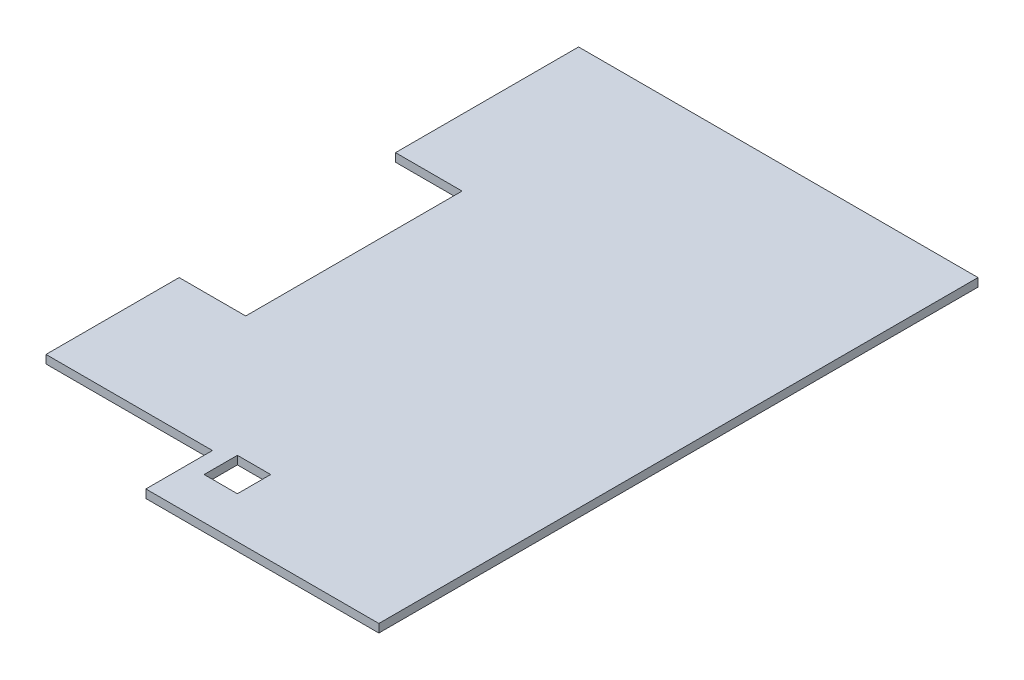
ISO-10303-21;
HEADER;
FILE_DESCRIPTION(('STEP AP214'),'2;1');
FILE_NAME('part.step','',(''),(''),'','','');
FILE_SCHEMA(('AUTOMOTIVE_DESIGN { 1 0 10303 214 1 1 1 1 }'));
ENDSEC;
DATA;
#1=APPLICATION_CONTEXT('core data for automotive mechanical design processes');
#2=APPLICATION_PROTOCOL_DEFINITION('international standard','automotive_design',2000,#1);
#3=PRODUCT_CONTEXT('',#1,'mechanical');
#4=PRODUCT('Part','Part','',(#3));
#5=PRODUCT_RELATED_PRODUCT_CATEGORY('part','',(#4));
#6=PRODUCT_DEFINITION_FORMATION('','',#4);
#7=PRODUCT_DEFINITION_CONTEXT('part definition',#1,'design');
#8=PRODUCT_DEFINITION('design','',#6,#7);
#9=PRODUCT_DEFINITION_SHAPE('','',#8);
#10=(LENGTH_UNIT() NAMED_UNIT(*) SI_UNIT(.MILLI.,.METRE.));
#11=(NAMED_UNIT(*) PLANE_ANGLE_UNIT() SI_UNIT($,.RADIAN.));
#12=(NAMED_UNIT(*) SI_UNIT($,.STERADIAN.) SOLID_ANGLE_UNIT());
#13=UNCERTAINTY_MEASURE_WITH_UNIT(LENGTH_MEASURE(1.E-05),#10,'distance_accuracy_value','');
#14=(GEOMETRIC_REPRESENTATION_CONTEXT(3) GLOBAL_UNCERTAINTY_ASSIGNED_CONTEXT((#13)) GLOBAL_UNIT_ASSIGNED_CONTEXT((#10,
#11,#12)) REPRESENTATION_CONTEXT('',''));
#15=CARTESIAN_POINT('',(0.,0.,0.));
#16=DIRECTION('',(0.,0.,1.));
#17=DIRECTION('',(1.,0.,0.));
#18=AXIS2_PLACEMENT_3D('',#15,#16,#17);
#19=CARTESIAN_POINT('',(0.,12.7,-203.2));
#20=DIRECTION('',(1.,0.,0.));
#21=DIRECTION('',(0.,0.,-1.));
#22=AXIS2_PLACEMENT_3D('',#19,#20,#21);
#23=PLANE('',#22);
#24=DIRECTION('',(0.,0.,1.));
#25=VECTOR('',#24,1.);
#26=CARTESIAN_POINT('',(0.,0.,-203.2));
#27=LINE('',#26,#25);
#28=CARTESIAN_POINT('',(0.,0.,-203.2));
#29=VERTEX_POINT('',#28);
#30=CARTESIAN_POINT('',(0.,0.,0.));
#31=VERTEX_POINT('',#30);
#32=EDGE_CURVE('E166',#29,#31,#27,.T.);
#33=ORIENTED_EDGE('',*,*,#32,.T.);
#34=DIRECTION('',(0.,-1.,0.));
#35=VECTOR('',#34,1.);
#36=CARTESIAN_POINT('',(0.,12.7,0.));
#37=LINE('',#36,#35);
#38=CARTESIAN_POINT('',(0.,12.7,0.));
#39=VERTEX_POINT('',#38);
#40=EDGE_CURVE('E11',#39,#31,#37,.T.);
#41=ORIENTED_EDGE('',*,*,#40,.F.);
#42=DIRECTION('',(0.,0.,1.));
#43=VECTOR('',#42,1.);
#44=CARTESIAN_POINT('',(0.,12.7,-203.2));
#45=LINE('',#44,#43);
#46=CARTESIAN_POINT('',(0.,12.7,-203.2));
#47=VERTEX_POINT('',#46);
#48=EDGE_CURVE('E170',#47,#39,#45,.T.);
#49=ORIENTED_EDGE('',*,*,#48,.F.);
#50=DIRECTION('',(0.,-1.,0.));
#51=VECTOR('',#50,1.);
#52=CARTESIAN_POINT('',(0.,12.7,-203.2));
#53=LINE('',#52,#51);
#54=EDGE_CURVE('E192',#47,#29,#53,.T.);
#55=ORIENTED_EDGE('',*,*,#54,.T.);
#56=EDGE_LOOP('',(#33,#41,#49,#55));
#57=FACE_BOUND('',#56,.T.);
#58=ADVANCED_FACE('F33',(#57),#23,.F.);
#59=CARTESIAN_POINT('',(0.,12.7,0.));
#60=DIRECTION('',(0.,0.,-1.));
#61=DIRECTION('',(-1.,0.,0.));
#62=AXIS2_PLACEMENT_3D('',#59,#60,#61);
#63=PLANE('',#62);
#64=DIRECTION('',(1.,0.,0.));
#65=VECTOR('',#64,1.);
#66=CARTESIAN_POINT('',(0.,0.,0.));
#67=LINE('',#66,#65);
#68=CARTESIAN_POINT('',(254.,0.,0.));
#69=VERTEX_POINT('',#68);
#70=EDGE_CURVE('E195',#31,#69,#67,.T.);
#71=ORIENTED_EDGE('',*,*,#70,.T.);
#72=DIRECTION('',(0.,-1.,0.));
#73=VECTOR('',#72,1.);
#74=CARTESIAN_POINT('',(254.,12.7,0.));
#75=LINE('',#74,#73);
#76=CARTESIAN_POINT('',(254.,12.7,0.));
#77=VERTEX_POINT('',#76);
#78=EDGE_CURVE('E40',#77,#69,#75,.T.);
#79=ORIENTED_EDGE('',*,*,#78,.F.);
#80=DIRECTION('',(1.,0.,0.));
#81=VECTOR('',#80,1.);
#82=CARTESIAN_POINT('',(0.,12.7,0.));
#83=LINE('',#82,#81);
#84=EDGE_CURVE('E173',#39,#77,#83,.T.);
#85=ORIENTED_EDGE('',*,*,#84,.F.);
#86=ORIENTED_EDGE('',*,*,#40,.T.);
#87=EDGE_LOOP('',(#71,#79,#85,#86));
#88=FACE_BOUND('',#87,.T.);
#89=ADVANCED_FACE('F260',(#88),#63,.F.);
#90=CARTESIAN_POINT('',(254.,12.7,0.));
#91=DIRECTION('',(1.,0.,0.));
#92=DIRECTION('',(0.,0.,-1.));
#93=AXIS2_PLACEMENT_3D('',#90,#91,#92);
#94=PLANE('',#93);
#95=DIRECTION('',(0.,0.,1.));
#96=VECTOR('',#95,1.);
#97=CARTESIAN_POINT('',(254.,0.,0.));
#98=LINE('',#97,#96);
#99=CARTESIAN_POINT('',(254.,0.,101.6));
#100=VERTEX_POINT('',#99);
#101=EDGE_CURVE('E197',#69,#100,#98,.T.);
#102=ORIENTED_EDGE('',*,*,#101,.T.);
#103=DIRECTION('',(0.,-1.,0.));
#104=VECTOR('',#103,1.);
#105=CARTESIAN_POINT('',(254.,12.7,101.6));
#106=LINE('',#105,#104);
#107=CARTESIAN_POINT('',(254.,12.7,101.6));
#108=VERTEX_POINT('',#107);
#109=EDGE_CURVE('E232',#108,#100,#106,.T.);
#110=ORIENTED_EDGE('',*,*,#109,.F.);
#111=DIRECTION('',(0.,0.,1.));
#112=VECTOR('',#111,1.);
#113=CARTESIAN_POINT('',(254.,12.7,0.));
#114=LINE('',#113,#112);
#115=EDGE_CURVE('E176',#77,#108,#114,.T.);
#116=ORIENTED_EDGE('',*,*,#115,.F.);
#117=ORIENTED_EDGE('',*,*,#78,.T.);
#118=EDGE_LOOP('',(#102,#110,#116,#117));
#119=FACE_BOUND('',#118,.T.);
#120=ADVANCED_FACE('F239',(#119),#94,.F.);
#121=CARTESIAN_POINT('',(254.,12.7,101.6));
#122=DIRECTION('',(0.,0.,-1.));
#123=DIRECTION('',(-1.,0.,0.));
#124=AXIS2_PLACEMENT_3D('',#121,#122,#123);
#125=PLANE('',#124);
#126=DIRECTION('',(1.,0.,0.));
#127=VECTOR('',#126,1.);
#128=CARTESIAN_POINT('',(254.,0.,101.6));
#129=LINE('',#128,#127);
#130=CARTESIAN_POINT('',(609.6,0.,101.6));
#131=VERTEX_POINT('',#130);
#132=EDGE_CURVE('E199',#100,#131,#129,.T.);
#133=ORIENTED_EDGE('',*,*,#132,.T.);
#134=DIRECTION('',(0.,-1.,0.));
#135=VECTOR('',#134,1.);
#136=CARTESIAN_POINT('',(609.6,12.7,101.6));
#137=LINE('',#136,#135);
#138=CARTESIAN_POINT('',(609.6,12.7,101.6));
#139=VERTEX_POINT('',#138);
#140=EDGE_CURVE('E229',#139,#131,#137,.T.);
#141=ORIENTED_EDGE('',*,*,#140,.F.);
#142=DIRECTION('',(1.,0.,0.));
#143=VECTOR('',#142,1.);
#144=CARTESIAN_POINT('',(254.,12.7,101.6));
#145=LINE('',#144,#143);
#146=EDGE_CURVE('E178',#108,#139,#145,.T.);
#147=ORIENTED_EDGE('',*,*,#146,.F.);
#148=ORIENTED_EDGE('',*,*,#109,.T.);
#149=EDGE_LOOP('',(#133,#141,#147,#148));
#150=FACE_BOUND('',#149,.T.);
#151=ADVANCED_FACE('F248',(#150),#125,.F.);
#152=CARTESIAN_POINT('',(609.6,12.7,101.6));
#153=DIRECTION('',(-1.,0.,0.));
#154=DIRECTION('',(0.,0.,1.));
#155=AXIS2_PLACEMENT_3D('',#152,#153,#154);
#156=PLANE('',#155);
#157=DIRECTION('',(0.,0.,-1.));
#158=VECTOR('',#157,1.);
#159=CARTESIAN_POINT('',(609.6,0.,101.6));
#160=LINE('',#159,#158);
#161=CARTESIAN_POINT('',(609.6,0.,-812.8));
#162=VERTEX_POINT('',#161);
#163=EDGE_CURVE('E201',#131,#162,#160,.T.);
#164=ORIENTED_EDGE('',*,*,#163,.T.);
#165=DIRECTION('',(0.,-1.,0.));
#166=VECTOR('',#165,1.);
#167=CARTESIAN_POINT('',(609.6,12.7,-812.8));
#168=LINE('',#167,#166);
#169=CARTESIAN_POINT('',(609.6,12.7,-812.8));
#170=VERTEX_POINT('',#169);
#171=EDGE_CURVE('E226',#170,#162,#168,.T.);
#172=ORIENTED_EDGE('',*,*,#171,.F.);
#173=DIRECTION('',(0.,0.,-1.));
#174=VECTOR('',#173,1.);
#175=CARTESIAN_POINT('',(609.6,12.7,101.6));
#176=LINE('',#175,#174);
#177=EDGE_CURVE('E180',#139,#170,#176,.T.);
#178=ORIENTED_EDGE('',*,*,#177,.F.);
#179=ORIENTED_EDGE('',*,*,#140,.T.);
#180=EDGE_LOOP('',(#164,#172,#178,#179));
#181=FACE_BOUND('',#180,.T.);
#182=ADVANCED_FACE('F252',(#181),#156,.F.);
#183=CARTESIAN_POINT('',(609.6,12.7,-812.8));
#184=DIRECTION('',(0.,0.,1.));
#185=DIRECTION('',(1.,0.,0.));
#186=AXIS2_PLACEMENT_3D('',#183,#184,#185);
#187=PLANE('',#186);
#188=DIRECTION('',(-1.,0.,0.));
#189=VECTOR('',#188,1.);
#190=CARTESIAN_POINT('',(609.6,0.,-812.8));
#191=LINE('',#190,#189);
#192=CARTESIAN_POINT('',(0.,0.,-812.8));
#193=VERTEX_POINT('',#192);
#194=EDGE_CURVE('E203',#162,#193,#191,.T.);
#195=ORIENTED_EDGE('',*,*,#194,.T.);
#196=DIRECTION('',(0.,-1.,0.));
#197=VECTOR('',#196,1.);
#198=CARTESIAN_POINT('',(0.,12.7,-812.8));
#199=LINE('',#198,#197);
#200=CARTESIAN_POINT('',(0.,12.7,-812.8));
#201=VERTEX_POINT('',#200);
#202=EDGE_CURVE('E223',#201,#193,#199,.T.);
#203=ORIENTED_EDGE('',*,*,#202,.F.);
#204=DIRECTION('',(-1.,0.,0.));
#205=VECTOR('',#204,1.);
#206=CARTESIAN_POINT('',(609.6,12.7,-812.8));
#207=LINE('',#206,#205);
#208=EDGE_CURVE('E182',#170,#201,#207,.T.);
#209=ORIENTED_EDGE('',*,*,#208,.F.);
#210=ORIENTED_EDGE('',*,*,#171,.T.);
#211=EDGE_LOOP('',(#195,#203,#209,#210));
#212=FACE_BOUND('',#211,.T.);
#213=ADVANCED_FACE('F283',(#212),#187,.F.);
#214=CARTESIAN_POINT('',(0.,12.7,-812.8));
#215=DIRECTION('',(1.,0.,0.));
#216=DIRECTION('',(0.,0.,-1.));
#217=AXIS2_PLACEMENT_3D('',#214,#215,#216);
#218=PLANE('',#217);
#219=DIRECTION('',(0.,0.,1.));
#220=VECTOR('',#219,1.);
#221=CARTESIAN_POINT('',(0.,0.,-812.8));
#222=LINE('',#221,#220);
#223=CARTESIAN_POINT('',(0.,0.,-533.4));
#224=VERTEX_POINT('',#223);
#225=EDGE_CURVE('E205',#193,#224,#222,.T.);
#226=ORIENTED_EDGE('',*,*,#225,.T.);
#227=DIRECTION('',(0.,-1.,0.));
#228=VECTOR('',#227,1.);
#229=CARTESIAN_POINT('',(0.,12.7,-533.4));
#230=LINE('',#229,#228);
#231=CARTESIAN_POINT('',(0.,12.7,-533.4));
#232=VERTEX_POINT('',#231);
#233=EDGE_CURVE('E220',#232,#224,#230,.T.);
#234=ORIENTED_EDGE('',*,*,#233,.F.);
#235=DIRECTION('',(0.,0.,1.));
#236=VECTOR('',#235,1.);
#237=CARTESIAN_POINT('',(0.,12.7,-812.8));
#238=LINE('',#237,#236);
#239=EDGE_CURVE('E184',#201,#232,#238,.T.);
#240=ORIENTED_EDGE('',*,*,#239,.F.);
#241=ORIENTED_EDGE('',*,*,#202,.T.);
#242=EDGE_LOOP('',(#226,#234,#240,#241));
#243=FACE_BOUND('',#242,.T.);
#244=ADVANCED_FACE('F280',(#243),#218,.F.);
#245=CARTESIAN_POINT('',(0.,12.7,-533.4));
#246=DIRECTION('',(0.,0.,-1.));
#247=DIRECTION('',(-1.,0.,0.));
#248=AXIS2_PLACEMENT_3D('',#245,#246,#247);
#249=PLANE('',#248);
#250=DIRECTION('',(1.,0.,0.));
#251=VECTOR('',#250,1.);
#252=CARTESIAN_POINT('',(0.,0.,-533.4));
#253=LINE('',#252,#251);
#254=CARTESIAN_POINT('',(101.6,0.,-533.4));
#255=VERTEX_POINT('',#254);
#256=EDGE_CURVE('E207',#224,#255,#253,.T.);
#257=ORIENTED_EDGE('',*,*,#256,.T.);
#258=DIRECTION('',(0.,-1.,0.));
#259=VECTOR('',#258,1.);
#260=CARTESIAN_POINT('',(101.6,12.7,-533.4));
#261=LINE('',#260,#259);
#262=CARTESIAN_POINT('',(101.6,12.7,-533.4));
#263=VERTEX_POINT('',#262);
#264=EDGE_CURVE('E217',#263,#255,#261,.T.);
#265=ORIENTED_EDGE('',*,*,#264,.F.);
#266=DIRECTION('',(1.,0.,0.));
#267=VECTOR('',#266,1.);
#268=CARTESIAN_POINT('',(0.,12.7,-533.4));
#269=LINE('',#268,#267);
#270=EDGE_CURVE('E186',#232,#263,#269,.T.);
#271=ORIENTED_EDGE('',*,*,#270,.F.);
#272=ORIENTED_EDGE('',*,*,#233,.T.);
#273=EDGE_LOOP('',(#257,#265,#271,#272));
#274=FACE_BOUND('',#273,.T.);
#275=ADVANCED_FACE('F276',(#274),#249,.F.);
#276=CARTESIAN_POINT('',(101.6,12.7,-533.4));
#277=DIRECTION('',(1.,0.,0.));
#278=DIRECTION('',(0.,0.,-1.));
#279=AXIS2_PLACEMENT_3D('',#276,#277,#278);
#280=PLANE('',#279);
#281=DIRECTION('',(0.,0.,1.));
#282=VECTOR('',#281,1.);
#283=CARTESIAN_POINT('',(101.6,0.,-533.4));
#284=LINE('',#283,#282);
#285=CARTESIAN_POINT('',(101.6,0.,-203.2));
#286=VERTEX_POINT('',#285);
#287=EDGE_CURVE('E209',#255,#286,#284,.T.);
#288=ORIENTED_EDGE('',*,*,#287,.T.);
#289=DIRECTION('',(0.,-1.,0.));
#290=VECTOR('',#289,1.);
#291=CARTESIAN_POINT('',(101.6,12.7,-203.2));
#292=LINE('',#291,#290);
#293=CARTESIAN_POINT('',(101.6,12.7,-203.2));
#294=VERTEX_POINT('',#293);
#295=EDGE_CURVE('E214',#294,#286,#292,.T.);
#296=ORIENTED_EDGE('',*,*,#295,.F.);
#297=DIRECTION('',(0.,0.,1.));
#298=VECTOR('',#297,1.);
#299=CARTESIAN_POINT('',(101.6,12.7,-533.4));
#300=LINE('',#299,#298);
#301=EDGE_CURVE('E188',#263,#294,#300,.T.);
#302=ORIENTED_EDGE('',*,*,#301,.F.);
#303=ORIENTED_EDGE('',*,*,#264,.T.);
#304=EDGE_LOOP('',(#288,#296,#302,#303));
#305=FACE_BOUND('',#304,.T.);
#306=ADVANCED_FACE('F272',(#305),#280,.F.);
#307=CARTESIAN_POINT('',(101.6,12.7,-203.2));
#308=DIRECTION('',(0.,0.,1.));
#309=DIRECTION('',(1.,0.,0.));
#310=AXIS2_PLACEMENT_3D('',#307,#308,#309);
#311=PLANE('',#310);
#312=DIRECTION('',(-1.,0.,0.));
#313=VECTOR('',#312,1.);
#314=CARTESIAN_POINT('',(101.6,0.,-203.2));
#315=LINE('',#314,#313);
#316=EDGE_CURVE('E174',#286,#29,#315,.T.);
#317=ORIENTED_EDGE('',*,*,#316,.T.);
#318=ORIENTED_EDGE('',*,*,#54,.F.);
#319=DIRECTION('',(-1.,0.,0.));
#320=VECTOR('',#319,1.);
#321=CARTESIAN_POINT('',(101.6,12.7,-203.2));
#322=LINE('',#321,#320);
#323=EDGE_CURVE('E190',#294,#47,#322,.T.);
#324=ORIENTED_EDGE('',*,*,#323,.F.);
#325=ORIENTED_EDGE('',*,*,#295,.T.);
#326=EDGE_LOOP('',(#317,#318,#324,#325));
#327=FACE_BOUND('',#326,.T.);
#328=ADVANCED_FACE('F267',(#327),#311,.F.);
#329=CARTESIAN_POINT('',(0.,12.7,0.));
#330=DIRECTION('',(0.,1.,0.));
#331=DIRECTION('',(0.,0.,1.));
#332=AXIS2_PLACEMENT_3D('',#329,#330,#331);
#333=PLANE('',#332);
#334=DIRECTION('',(-1.,0.,0.));
#335=VECTOR('',#334,1.);
#336=CARTESIAN_POINT('',(330.2,12.7,-12.7));
#337=LINE('',#336,#335);
#338=CARTESIAN_POINT('',(330.2,12.7,-12.7));
#339=VERTEX_POINT('',#338);
#340=CARTESIAN_POINT('',(279.4,12.7,-12.7));
#341=VERTEX_POINT('',#340);
#342=EDGE_CURVE('E47',#339,#341,#337,.T.);
#343=ORIENTED_EDGE('',*,*,#342,.F.);
#344=DIRECTION('',(0.,0.,-1.));
#345=VECTOR('',#344,1.);
#346=CARTESIAN_POINT('',(330.2,12.7,38.1));
#347=LINE('',#346,#345);
#348=CARTESIAN_POINT('',(330.2,12.7,38.1));
#349=VERTEX_POINT('',#348);
#350=EDGE_CURVE('E151',#349,#339,#347,.T.);
#351=ORIENTED_EDGE('',*,*,#350,.F.);
#352=DIRECTION('',(1.,0.,0.));
#353=VECTOR('',#352,1.);
#354=CARTESIAN_POINT('',(279.4,12.7,38.1));
#355=LINE('',#354,#353);
#356=CARTESIAN_POINT('',(279.4,12.7,38.1));
#357=VERTEX_POINT('',#356);
#358=EDGE_CURVE('E154',#357,#349,#355,.T.);
#359=ORIENTED_EDGE('',*,*,#358,.F.);
#360=DIRECTION('',(0.,0.,1.));
#361=VECTOR('',#360,1.);
#362=CARTESIAN_POINT('',(279.4,12.7,-12.7));
#363=LINE('',#362,#361);
#364=EDGE_CURVE('E160',#341,#357,#363,.T.);
#365=ORIENTED_EDGE('',*,*,#364,.F.);
#366=EDGE_LOOP('',(#343,#351,#359,#365));
#367=FACE_BOUND('',#366,.T.);
#368=ORIENTED_EDGE('',*,*,#48,.T.);
#369=ORIENTED_EDGE('',*,*,#84,.T.);
#370=ORIENTED_EDGE('',*,*,#115,.T.);
#371=ORIENTED_EDGE('',*,*,#146,.T.);
#372=ORIENTED_EDGE('',*,*,#177,.T.);
#373=ORIENTED_EDGE('',*,*,#208,.T.);
#374=ORIENTED_EDGE('',*,*,#239,.T.);
#375=ORIENTED_EDGE('',*,*,#270,.T.);
#376=ORIENTED_EDGE('',*,*,#301,.T.);
#377=ORIENTED_EDGE('',*,*,#323,.T.);
#378=EDGE_LOOP('',(#368,#369,#370,#371,#372,#373,#374,#375,#376,#377));
#379=FACE_BOUND('',#378,.T.);
#380=ADVANCED_FACE('F256',(#367,#379),#333,.T.);
#381=CARTESIAN_POINT('',(0.,0.,0.));
#382=DIRECTION('',(0.,1.,0.));
#383=DIRECTION('',(0.,0.,1.));
#384=AXIS2_PLACEMENT_3D('',#381,#382,#383);
#385=PLANE('',#384);
#386=DIRECTION('',(0.,0.,-1.));
#387=VECTOR('',#386,1.);
#388=CARTESIAN_POINT('',(330.2,0.,38.1));
#389=LINE('',#388,#387);
#390=CARTESIAN_POINT('',(330.2,0.,38.1));
#391=VERTEX_POINT('',#390);
#392=CARTESIAN_POINT('',(330.2,0.,-12.7));
#393=VERTEX_POINT('',#392);
#394=EDGE_CURVE('E141',#391,#393,#389,.T.);
#395=ORIENTED_EDGE('',*,*,#394,.T.);
#396=DIRECTION('',(-1.,0.,0.));
#397=VECTOR('',#396,1.);
#398=CARTESIAN_POINT('',(330.2,0.,-12.7));
#399=LINE('',#398,#397);
#400=CARTESIAN_POINT('',(279.4,0.,-12.7));
#401=VERTEX_POINT('',#400);
#402=EDGE_CURVE('E135',#393,#401,#399,.T.);
#403=ORIENTED_EDGE('',*,*,#402,.T.);
#404=DIRECTION('',(0.,0.,1.));
#405=VECTOR('',#404,1.);
#406=CARTESIAN_POINT('',(279.4,0.,-12.7));
#407=LINE('',#406,#405);
#408=CARTESIAN_POINT('',(279.4,0.,38.1));
#409=VERTEX_POINT('',#408);
#410=EDGE_CURVE('E144',#401,#409,#407,.T.);
#411=ORIENTED_EDGE('',*,*,#410,.T.);
#412=DIRECTION('',(1.,0.,0.));
#413=VECTOR('',#412,1.);
#414=CARTESIAN_POINT('',(279.4,0.,38.1));
#415=LINE('',#414,#413);
#416=EDGE_CURVE('E55',#409,#391,#415,.T.);
#417=ORIENTED_EDGE('',*,*,#416,.T.);
#418=EDGE_LOOP('',(#395,#403,#411,#417));
#419=FACE_BOUND('',#418,.T.);
#420=ORIENTED_EDGE('',*,*,#32,.F.);
#421=ORIENTED_EDGE('',*,*,#316,.F.);
#422=ORIENTED_EDGE('',*,*,#287,.F.);
#423=ORIENTED_EDGE('',*,*,#256,.F.);
#424=ORIENTED_EDGE('',*,*,#225,.F.);
#425=ORIENTED_EDGE('',*,*,#194,.F.);
#426=ORIENTED_EDGE('',*,*,#163,.F.);
#427=ORIENTED_EDGE('',*,*,#132,.F.);
#428=ORIENTED_EDGE('',*,*,#101,.F.);
#429=ORIENTED_EDGE('',*,*,#70,.F.);
#430=EDGE_LOOP('',(#420,#421,#422,#423,#424,#425,#426,#427,#428,#429));
#431=FACE_BOUND('',#430,.T.);
#432=ADVANCED_FACE('F148',(#419,#431),#385,.F.);
#433=CARTESIAN_POINT('',(330.2,0.,-12.7));
#434=DIRECTION('',(0.,0.,-1.));
#435=DIRECTION('',(-1.,0.,0.));
#436=AXIS2_PLACEMENT_3D('',#433,#434,#435);
#437=PLANE('',#436);
#438=ORIENTED_EDGE('',*,*,#342,.T.);
#439=DIRECTION('',(0.,1.,0.));
#440=VECTOR('',#439,1.);
#441=CARTESIAN_POINT('',(279.4,0.,-12.7));
#442=LINE('',#441,#440);
#443=EDGE_CURVE('E131',#401,#341,#442,.T.);
#444=ORIENTED_EDGE('',*,*,#443,.F.);
#445=ORIENTED_EDGE('',*,*,#402,.F.);
#446=DIRECTION('',(0.,1.,0.));
#447=VECTOR('',#446,1.);
#448=CARTESIAN_POINT('',(330.2,0.,-12.7));
#449=LINE('',#448,#447);
#450=EDGE_CURVE('E164',#393,#339,#449,.T.);
#451=ORIENTED_EDGE('',*,*,#450,.T.);
#452=EDGE_LOOP('',(#438,#444,#445,#451));
#453=FACE_BOUND('',#452,.T.);
#454=ADVANCED_FACE('F133',(#453),#437,.F.);
#455=CARTESIAN_POINT('',(330.2,0.,38.1));
#456=DIRECTION('',(1.,0.,0.));
#457=DIRECTION('',(0.,0.,-1.));
#458=AXIS2_PLACEMENT_3D('',#455,#456,#457);
#459=PLANE('',#458);
#460=ORIENTED_EDGE('',*,*,#350,.T.);
#461=ORIENTED_EDGE('',*,*,#450,.F.);
#462=ORIENTED_EDGE('',*,*,#394,.F.);
#463=DIRECTION('',(0.,1.,0.));
#464=VECTOR('',#463,1.);
#465=CARTESIAN_POINT('',(330.2,0.,38.1));
#466=LINE('',#465,#464);
#467=EDGE_CURVE('E167',#391,#349,#466,.T.);
#468=ORIENTED_EDGE('',*,*,#467,.T.);
#469=EDGE_LOOP('',(#460,#461,#462,#468));
#470=FACE_BOUND('',#469,.T.);
#471=ADVANCED_FACE('F370',(#470),#459,.F.);
#472=CARTESIAN_POINT('',(279.4,0.,38.1));
#473=DIRECTION('',(0.,0.,1.));
#474=DIRECTION('',(1.,0.,0.));
#475=AXIS2_PLACEMENT_3D('',#472,#473,#474);
#476=PLANE('',#475);
#477=ORIENTED_EDGE('',*,*,#358,.T.);
#478=ORIENTED_EDGE('',*,*,#467,.F.);
#479=ORIENTED_EDGE('',*,*,#416,.F.);
#480=DIRECTION('',(0.,1.,0.));
#481=VECTOR('',#480,1.);
#482=CARTESIAN_POINT('',(279.4,0.,38.1));
#483=LINE('',#482,#481);
#484=EDGE_CURVE('E140',#409,#357,#483,.T.);
#485=ORIENTED_EDGE('',*,*,#484,.T.);
#486=EDGE_LOOP('',(#477,#478,#479,#485));
#487=FACE_BOUND('',#486,.T.);
#488=ADVANCED_FACE('F379',(#487),#476,.F.);
#489=CARTESIAN_POINT('',(279.4,0.,-12.7));
#490=DIRECTION('',(-1.,0.,0.));
#491=DIRECTION('',(0.,0.,1.));
#492=AXIS2_PLACEMENT_3D('',#489,#490,#491);
#493=PLANE('',#492);
#494=ORIENTED_EDGE('',*,*,#364,.T.);
#495=ORIENTED_EDGE('',*,*,#484,.F.);
#496=ORIENTED_EDGE('',*,*,#410,.F.);
#497=ORIENTED_EDGE('',*,*,#443,.T.);
#498=EDGE_LOOP('',(#494,#495,#496,#497));
#499=FACE_BOUND('',#498,.T.);
#500=ADVANCED_FACE('F145',(#499),#493,.F.);
#501=CLOSED_SHELL('',(#58,#89,#120,#151,#182,#213,#244,#275,#306,#328,#380,#432,#454,#471,#488,#500));
#502=MANIFOLD_SOLID_BREP('B2',#501);
#503=ADVANCED_BREP_SHAPE_REPRESENTATION('',(#18,#502),#14);
#504=SHAPE_DEFINITION_REPRESENTATION(#9,#503);
ENDSEC;
END-ISO-10303-21;
